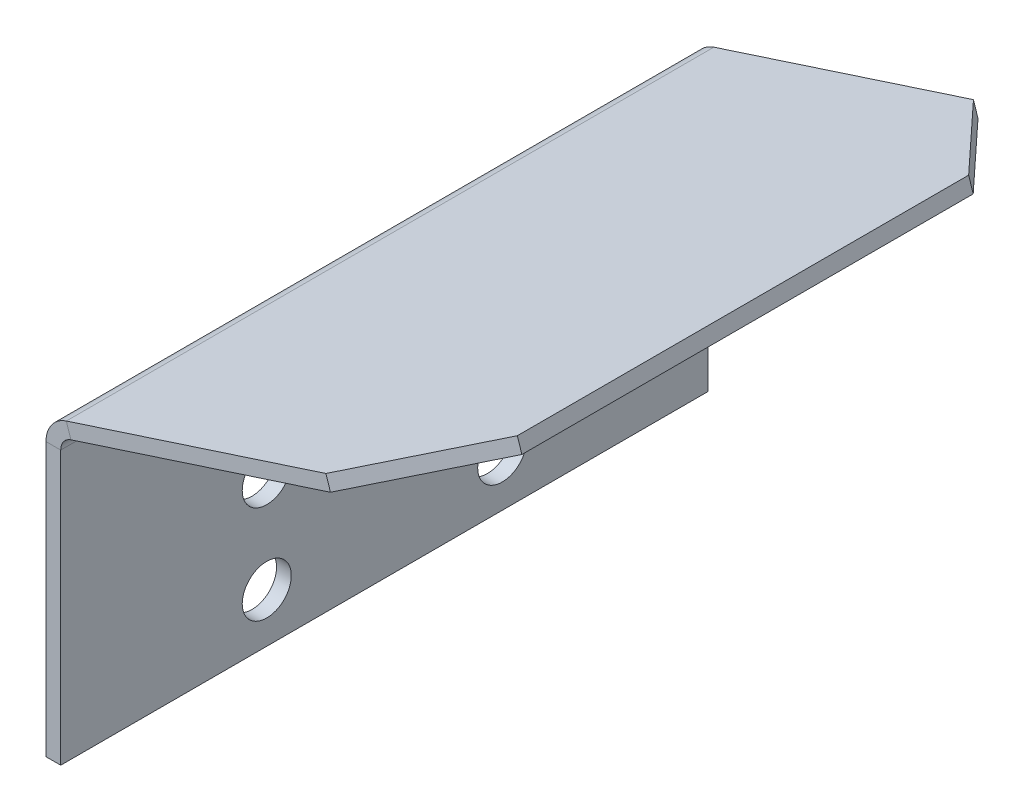
ISO-10303-21;
HEADER;
FILE_DESCRIPTION(('STEP AP214'),'2;1');
FILE_NAME('part.step','',(''),(''),'','','');
FILE_SCHEMA(('AUTOMOTIVE_DESIGN { 1 0 10303 214 1 1 1 1 }'));
ENDSEC;
DATA;
#1=APPLICATION_CONTEXT('core data for automotive mechanical design processes');
#2=APPLICATION_PROTOCOL_DEFINITION('international standard','automotive_design',2000,#1);
#3=PRODUCT_CONTEXT('',#1,'mechanical');
#4=PRODUCT('Part','Part','',(#3));
#5=PRODUCT_RELATED_PRODUCT_CATEGORY('part','',(#4));
#6=PRODUCT_DEFINITION_FORMATION('','',#4);
#7=PRODUCT_DEFINITION_CONTEXT('part definition',#1,'design');
#8=PRODUCT_DEFINITION('design','',#6,#7);
#9=PRODUCT_DEFINITION_SHAPE('','',#8);
#10=(LENGTH_UNIT() NAMED_UNIT(*) SI_UNIT(.MILLI.,.METRE.));
#11=(NAMED_UNIT(*) PLANE_ANGLE_UNIT() SI_UNIT($,.RADIAN.));
#12=(NAMED_UNIT(*) SI_UNIT($,.STERADIAN.) SOLID_ANGLE_UNIT());
#13=UNCERTAINTY_MEASURE_WITH_UNIT(LENGTH_MEASURE(1.E-05),#10,'distance_accuracy_value','');
#14=(GEOMETRIC_REPRESENTATION_CONTEXT(3) GLOBAL_UNCERTAINTY_ASSIGNED_CONTEXT((#13)) GLOBAL_UNIT_ASSIGNED_CONTEXT((#10,
#11,#12)) REPRESENTATION_CONTEXT('',''));
#15=CARTESIAN_POINT('',(0.,0.,0.));
#16=DIRECTION('',(0.,0.,1.));
#17=DIRECTION('',(1.,0.,0.));
#18=AXIS2_PLACEMENT_3D('',#15,#16,#17);
#19=CARTESIAN_POINT('',(2.07294901687517,0.673541964869374,33.));
#20=DIRECTION('',(0.,0.,1.));
#21=DIRECTION('',(1.,0.,0.));
#22=AXIS2_PLACEMENT_3D('',#19,#20,#21);
#23=PLANE('',#22);
#24=DIRECTION('',(0.309016994374945,-0.951056516295154,0.));
#25=VECTOR('',#24,1.);
#26=CARTESIAN_POINT('',(2.07294901687517,0.673541964869374,33.));
#27=LINE('',#26,#25);
#28=CARTESIAN_POINT('',(2.07294901687517,0.673541964869374,33.));
#29=VERTEX_POINT('',#28);
#30=CARTESIAN_POINT('',(2.53647450843758,-0.753042809573357,33.));
#31=VERTEX_POINT('',#30);
#32=EDGE_CURVE('E122',#29,#31,#27,.T.);
#33=ORIENTED_EDGE('',*,*,#32,.F.);
#34=CARTESIAN_POINT('',(3.,-2.17962758401609,33.));
#35=DIRECTION('',(0.,0.,1.));
#36=DIRECTION('',(1.,0.,0.));
#37=AXIS2_PLACEMENT_3D('',#34,#35,#36);
#38=CIRCLE('',#37,3.);
#39=CARTESIAN_POINT('',(0.,-2.17962758401609,33.));
#40=VERTEX_POINT('',#39);
#41=EDGE_CURVE('E125',#40,#29,#38,.F.);
#42=ORIENTED_EDGE('',*,*,#41,.F.);
#43=DIRECTION('',(-1.,0.,0.));
#44=VECTOR('',#43,1.);
#45=CARTESIAN_POINT('',(1.5,-2.17962758401609,33.));
#46=LINE('',#45,#44);
#47=CARTESIAN_POINT('',(1.5,-2.17962758401609,33.));
#48=VERTEX_POINT('',#47);
#49=EDGE_CURVE('E131',#48,#40,#46,.T.);
#50=ORIENTED_EDGE('',*,*,#49,.F.);
#51=CARTESIAN_POINT('',(3.,-2.17962758401609,33.));
#52=DIRECTION('',(0.,0.,1.));
#53=DIRECTION('',(1.,0.,0.));
#54=AXIS2_PLACEMENT_3D('',#51,#52,#53);
#55=CIRCLE('',#54,1.5);
#56=EDGE_CURVE('E128',#48,#31,#55,.F.);
#57=ORIENTED_EDGE('',*,*,#56,.T.);
#58=EDGE_LOOP('',(#33,#42,#50,#57));
#59=FACE_BOUND('',#58,.T.);
#60=ADVANCED_FACE('F45',(#59),#23,.T.);
#61=CARTESIAN_POINT('',(1.5,-2.17962758401609,33.));
#62=DIRECTION('',(0.,0.,1.));
#63=DIRECTION('',(1.,0.,0.));
#64=AXIS2_PLACEMENT_3D('',#61,#62,#63);
#65=PLANE('',#64);
#66=DIRECTION('',(0.951056516295155,0.309016994374945,0.));
#67=VECTOR('',#66,1.);
#68=CARTESIAN_POINT('',(0.463525491562417,-1.42658477444273,33.));
#69=LINE('',#68,#67);
#70=CARTESIAN_POINT('',(28.995220980417,7.84392505680559,33.));
#71=VERTEX_POINT('',#70);
#72=EDGE_CURVE('E149',#31,#71,#69,.T.);
#73=ORIENTED_EDGE('',*,*,#72,.T.);
#74=DIRECTION('',(-0.309016994374944,0.951056516295155,0.));
#75=VECTOR('',#74,1.);
#76=CARTESIAN_POINT('',(29.3155092177606,6.85817922158218,33.));
#77=LINE('',#76,#75);
#78=CARTESIAN_POINT('',(28.5316954888546,9.27050983124832,33.));
#79=VERTEX_POINT('',#78);
#80=EDGE_CURVE('E53',#71,#79,#77,.T.);
#81=ORIENTED_EDGE('',*,*,#80,.T.);
#82=DIRECTION('',(0.951056516295154,0.309016994374945,0.));
#83=VECTOR('',#82,1.);
#84=CARTESIAN_POINT('',(0.,0.,33.));
#85=LINE('',#84,#83);
#86=EDGE_CURVE('E138',#29,#79,#85,.T.);
#87=ORIENTED_EDGE('',*,*,#86,.F.);
#88=ORIENTED_EDGE('',*,*,#32,.T.);
#89=EDGE_LOOP('',(#73,#81,#87,#88));
#90=FACE_BOUND('',#89,.T.);
#91=ADVANCED_FACE('F148',(#90),#65,.T.);
#92=CARTESIAN_POINT('',(0.,-2.17962758401609,-33.));
#93=DIRECTION('',(0.,0.,-1.));
#94=DIRECTION('',(-1.,0.,0.));
#95=AXIS2_PLACEMENT_3D('',#92,#93,#94);
#96=PLANE('',#95);
#97=DIRECTION('',(1.,0.,0.));
#98=VECTOR('',#97,1.);
#99=CARTESIAN_POINT('',(0.,-2.17962758401609,-33.));
#100=LINE('',#99,#98);
#101=CARTESIAN_POINT('',(0.,-2.17962758401609,-33.));
#102=VERTEX_POINT('',#101);
#103=CARTESIAN_POINT('',(1.5,-2.17962758401609,-33.));
#104=VERTEX_POINT('',#103);
#105=EDGE_CURVE('E201',#102,#104,#100,.T.);
#106=ORIENTED_EDGE('',*,*,#105,.F.);
#107=CARTESIAN_POINT('',(3.,-2.17962758401609,-33.));
#108=DIRECTION('',(0.,0.,1.));
#109=DIRECTION('',(1.,0.,0.));
#110=AXIS2_PLACEMENT_3D('',#107,#108,#109);
#111=CIRCLE('',#110,3.);
#112=CARTESIAN_POINT('',(2.07294901687517,0.673541964869374,-33.));
#113=VERTEX_POINT('',#112);
#114=EDGE_CURVE('E172',#102,#113,#111,.F.);
#115=ORIENTED_EDGE('',*,*,#114,.T.);
#116=DIRECTION('',(-0.309016994374945,0.951056516295154,0.));
#117=VECTOR('',#116,1.);
#118=CARTESIAN_POINT('',(2.53647450843758,-0.753042809573357,-33.));
#119=LINE('',#118,#117);
#120=CARTESIAN_POINT('',(2.53647450843758,-0.753042809573357,-33.));
#121=VERTEX_POINT('',#120);
#122=EDGE_CURVE('E199',#121,#113,#119,.T.);
#123=ORIENTED_EDGE('',*,*,#122,.F.);
#124=CARTESIAN_POINT('',(3.,-2.17962758401609,-33.));
#125=DIRECTION('',(0.,0.,1.));
#126=DIRECTION('',(1.,0.,0.));
#127=AXIS2_PLACEMENT_3D('',#124,#125,#126);
#128=CIRCLE('',#127,1.5);
#129=EDGE_CURVE('E183',#104,#121,#128,.F.);
#130=ORIENTED_EDGE('',*,*,#129,.F.);
#131=EDGE_LOOP('',(#106,#115,#123,#130));
#132=FACE_BOUND('',#131,.T.);
#133=ADVANCED_FACE('F233',(#132),#96,.T.);
#134=CARTESIAN_POINT('',(2.53647450843758,-0.753042809573357,-33.));
#135=DIRECTION('',(0.,0.,-1.));
#136=DIRECTION('',(-1.,0.,0.));
#137=AXIS2_PLACEMENT_3D('',#134,#135,#136);
#138=PLANE('',#137);
#139=DIRECTION('',(0.,1.,0.));
#140=VECTOR('',#139,1.);
#141=CARTESIAN_POINT('',(0.,-30.,-33.));
#142=LINE('',#141,#140);
#143=CARTESIAN_POINT('',(0.,-30.,-33.));
#144=VERTEX_POINT('',#143);
#145=EDGE_CURVE('E174',#144,#102,#142,.T.);
#146=ORIENTED_EDGE('',*,*,#145,.T.);
#147=ORIENTED_EDGE('',*,*,#105,.T.);
#148=DIRECTION('',(0.,1.,0.));
#149=VECTOR('',#148,1.);
#150=CARTESIAN_POINT('',(1.5,-30.,-33.));
#151=LINE('',#150,#149);
#152=CARTESIAN_POINT('',(1.5,-30.,-33.));
#153=VERTEX_POINT('',#152);
#154=EDGE_CURVE('E180',#153,#104,#151,.T.);
#155=ORIENTED_EDGE('',*,*,#154,.F.);
#156=DIRECTION('',(-1.,0.,0.));
#157=VECTOR('',#156,1.);
#158=CARTESIAN_POINT('',(1.5,-30.,-33.));
#159=LINE('',#158,#157);
#160=EDGE_CURVE('E177',#153,#144,#159,.T.);
#161=ORIENTED_EDGE('',*,*,#160,.T.);
#162=EDGE_LOOP('',(#146,#147,#155,#161));
#163=FACE_BOUND('',#162,.T.);
#164=ADVANCED_FACE('F286',(#163),#138,.T.);
#165=CARTESIAN_POINT('',(0.463525491562417,-1.42658477444273,33.));
#166=DIRECTION('',(-0.309016994374945,0.951056516295154,0.));
#167=DIRECTION('',(-0.951056516295155,-0.309016994374945,0.));
#168=AXIS2_PLACEMENT_3D('',#165,#166,#167);
#169=PLANE('',#168);
#170=DIRECTION('',(0.,0.,-1.));
#171=VECTOR('',#170,1.);
#172=CARTESIAN_POINT('',(38.5057861433686,10.9340950005551,33.));
#173=LINE('',#172,#171);
#174=CARTESIAN_POINT('',(38.5057861433686,10.9340950005551,22.9999999999999));
#175=VERTEX_POINT('',#174);
#176=CARTESIAN_POINT('',(38.5057861433686,10.9340950005551,-22.9999999999999));
#177=VERTEX_POINT('',#176);
#178=EDGE_CURVE('E197',#175,#177,#173,.T.);
#179=ORIENTED_EDGE('',*,*,#178,.F.);
#180=DIRECTION('',(0.672498511963958,0.218508012224409,-0.707106781186548));
#181=VECTOR('',#180,1.);
#182=CARTESIAN_POINT('',(38.5057861433686,10.9340950005551,22.9999999999999));
#183=LINE('',#182,#181);
#184=EDGE_CURVE('E67',#175,#71,#183,.F.);
#185=ORIENTED_EDGE('',*,*,#184,.T.);
#186=ORIENTED_EDGE('',*,*,#72,.F.);
#187=DIRECTION('',(0.,0.,-1.));
#188=VECTOR('',#187,1.);
#189=CARTESIAN_POINT('',(2.53647450843758,-0.753042809573357,33.));
#190=LINE('',#189,#188);
#191=EDGE_CURVE('E166',#31,#121,#190,.T.);
#192=ORIENTED_EDGE('',*,*,#191,.T.);
#193=DIRECTION('',(0.951056516295155,0.309016994374945,0.));
#194=VECTOR('',#193,1.);
#195=CARTESIAN_POINT('',(0.463525491562417,-1.42658477444273,-33.));
#196=LINE('',#195,#194);
#197=CARTESIAN_POINT('',(28.995220980417,7.84392505680559,-33.));
#198=VERTEX_POINT('',#197);
#199=EDGE_CURVE('E167',#121,#198,#196,.T.);
#200=ORIENTED_EDGE('',*,*,#199,.T.);
#201=DIRECTION('',(0.672498511963958,0.218508012224409,0.707106781186548));
#202=VECTOR('',#201,1.);
#203=CARTESIAN_POINT('',(28.995220980417,7.84392505680559,-33.));
#204=LINE('',#203,#202);
#205=EDGE_CURVE('E206',#198,#177,#204,.T.);
#206=ORIENTED_EDGE('',*,*,#205,.T.);
#207=EDGE_LOOP('',(#179,#185,#186,#192,#200,#206));
#208=FACE_BOUND('',#207,.T.);
#209=ADVANCED_FACE('F222',(#208),#169,.F.);
#210=CARTESIAN_POINT('',(38.0422606518062,12.3606797749978,33.));
#211=DIRECTION('',(0.951056516295155,0.309016994374944,0.));
#212=DIRECTION('',(-0.309016994374944,0.951056516295155,0.));
#213=AXIS2_PLACEMENT_3D('',#210,#211,#212);
#214=PLANE('',#213);
#215=DIRECTION('',(0.,0.,-1.));
#216=VECTOR('',#215,1.);
#217=CARTESIAN_POINT('',(38.0422606518062,12.3606797749978,33.));
#218=LINE('',#217,#216);
#219=CARTESIAN_POINT('',(38.0422606518062,12.3606797749978,22.9999999999999));
#220=VERTEX_POINT('',#219);
#221=CARTESIAN_POINT('',(38.0422606518062,12.3606797749978,-22.9999999999999));
#222=VERTEX_POINT('',#221);
#223=EDGE_CURVE('E145',#220,#222,#218,.T.);
#224=ORIENTED_EDGE('',*,*,#223,.F.);
#225=DIRECTION('',(0.309016994374944,-0.951056516295155,0.));
#226=VECTOR('',#225,1.);
#227=CARTESIAN_POINT('',(38.0422606518062,12.3606797749978,22.9999999999999));
#228=LINE('',#227,#226);
#229=EDGE_CURVE('E214',#220,#175,#228,.T.);
#230=ORIENTED_EDGE('',*,*,#229,.T.);
#231=ORIENTED_EDGE('',*,*,#178,.T.);
#232=DIRECTION('',(-0.309016994374944,0.951056516295155,0.));
#233=VECTOR('',#232,1.);
#234=CARTESIAN_POINT('',(38.0422606518062,12.3606797749978,-22.9999999999999));
#235=LINE('',#234,#233);
#236=EDGE_CURVE('E209',#177,#222,#235,.T.);
#237=ORIENTED_EDGE('',*,*,#236,.T.);
#238=EDGE_LOOP('',(#224,#230,#231,#237));
#239=FACE_BOUND('',#238,.T.);
#240=ADVANCED_FACE('F220',(#239),#214,.T.);
#241=CARTESIAN_POINT('',(0.,0.,33.));
#242=DIRECTION('',(-0.309016994374945,0.951056516295154,0.));
#243=DIRECTION('',(-0.951056516295155,-0.309016994374945,0.));
#244=AXIS2_PLACEMENT_3D('',#241,#242,#243);
#245=PLANE('',#244);
#246=ORIENTED_EDGE('',*,*,#86,.T.);
#247=DIRECTION('',(-0.672498511963958,-0.218508012224409,0.707106781186548));
#248=VECTOR('',#247,1.);
#249=CARTESIAN_POINT('',(14.2658477444273,4.63525491562416,48.));
#250=LINE('',#249,#248);
#251=EDGE_CURVE('E11',#79,#220,#250,.F.);
#252=ORIENTED_EDGE('',*,*,#251,.T.);
#253=ORIENTED_EDGE('',*,*,#223,.T.);
#254=DIRECTION('',(-0.672498511963958,-0.218508012224409,-0.707106781186548));
#255=VECTOR('',#254,1.);
#256=CARTESIAN_POINT('',(45.6507127821674,14.8328157299973,-15.));
#257=LINE('',#256,#255);
#258=CARTESIAN_POINT('',(28.5316954888546,9.27050983124832,-33.));
#259=VERTEX_POINT('',#258);
#260=EDGE_CURVE('E212',#222,#259,#257,.T.);
#261=ORIENTED_EDGE('',*,*,#260,.T.);
#262=DIRECTION('',(0.951056516295154,0.309016994374945,0.));
#263=VECTOR('',#262,1.);
#264=CARTESIAN_POINT('',(0.,0.,-33.));
#265=LINE('',#264,#263);
#266=EDGE_CURVE('E141',#113,#259,#265,.T.);
#267=ORIENTED_EDGE('',*,*,#266,.F.);
#268=DIRECTION('',(0.,0.,-1.));
#269=VECTOR('',#268,1.);
#270=CARTESIAN_POINT('',(2.07294901687517,0.673541964869374,33.));
#271=LINE('',#270,#269);
#272=EDGE_CURVE('E136',#29,#113,#271,.T.);
#273=ORIENTED_EDGE('',*,*,#272,.F.);
#274=EDGE_LOOP('',(#246,#252,#253,#261,#267,#273));
#275=FACE_BOUND('',#274,.T.);
#276=ADVANCED_FACE('F137',(#275),#245,.T.);
#277=CARTESIAN_POINT('',(3.,-2.17962758401609,33.));
#278=DIRECTION('',(0.,0.,-1.));
#279=DIRECTION('',(-1.,0.,0.));
#280=AXIS2_PLACEMENT_3D('',#277,#278,#279);
#281=CYLINDRICAL_SURFACE('',#280,3.);
#282=ORIENTED_EDGE('',*,*,#114,.F.);
#283=DIRECTION('',(0.,0.,-1.));
#284=VECTOR('',#283,1.);
#285=CARTESIAN_POINT('',(0.,-2.17962758401609,33.));
#286=LINE('',#285,#284);
#287=EDGE_CURVE('E146',#40,#102,#286,.T.);
#288=ORIENTED_EDGE('',*,*,#287,.F.);
#289=ORIENTED_EDGE('',*,*,#41,.T.);
#290=ORIENTED_EDGE('',*,*,#272,.T.);
#291=EDGE_LOOP('',(#282,#288,#289,#290));
#292=FACE_BOUND('',#291,.T.);
#293=ADVANCED_FACE('F152',(#292),#281,.T.);
#294=CARTESIAN_POINT('',(0.,-30.,33.));
#295=DIRECTION('',(-1.,0.,0.));
#296=DIRECTION('',(0.,0.,1.));
#297=AXIS2_PLACEMENT_3D('',#294,#295,#296);
#298=PLANE('',#297);
#299=CARTESIAN_POINT('',(0.,-25.,-12.));
#300=DIRECTION('',(-1.,0.,0.));
#301=DIRECTION('',(0.,0.,1.));
#302=AXIS2_PLACEMENT_3D('',#299,#300,#301);
#303=CIRCLE('',#302,2.49999999999999);
#304=CARTESIAN_POINT('',(0.,-25.,-9.50000000000004));
#305=VERTEX_POINT('',#304);
#306=EDGE_CURVE('E251',#305,#305,#303,.T.);
#307=ORIENTED_EDGE('',*,*,#306,.F.);
#308=EDGE_LOOP('',(#307));
#309=FACE_BOUND('',#308,.T.);
#310=CARTESIAN_POINT('',(0.,-15.,12.));
#311=DIRECTION('',(-1.,0.,0.));
#312=DIRECTION('',(0.,0.,1.));
#313=AXIS2_PLACEMENT_3D('',#310,#311,#312);
#314=CIRCLE('',#313,2.49999999999999);
#315=CARTESIAN_POINT('',(0.,-15.,14.5));
#316=VERTEX_POINT('',#315);
#317=EDGE_CURVE('E244',#316,#316,#314,.T.);
#318=ORIENTED_EDGE('',*,*,#317,.F.);
#319=EDGE_LOOP('',(#318));
#320=FACE_BOUND('',#319,.T.);
#321=CARTESIAN_POINT('',(0.,-15.,-12.));
#322=DIRECTION('',(-1.,0.,0.));
#323=DIRECTION('',(0.,0.,1.));
#324=AXIS2_PLACEMENT_3D('',#321,#322,#323);
#325=CIRCLE('',#324,2.49999999999999);
#326=CARTESIAN_POINT('',(0.,-15.,-9.50000000000004));
#327=VERTEX_POINT('',#326);
#328=EDGE_CURVE('E256',#327,#327,#325,.T.);
#329=ORIENTED_EDGE('',*,*,#328,.F.);
#330=EDGE_LOOP('',(#329));
#331=FACE_BOUND('',#330,.T.);
#332=CARTESIAN_POINT('',(0.,-25.,12.));
#333=DIRECTION('',(-1.,0.,0.));
#334=DIRECTION('',(0.,0.,1.));
#335=AXIS2_PLACEMENT_3D('',#332,#333,#334);
#336=CIRCLE('',#335,2.49999999999999);
#337=CARTESIAN_POINT('',(0.,-25.,14.5));
#338=VERTEX_POINT('',#337);
#339=EDGE_CURVE('E238',#338,#338,#336,.T.);
#340=ORIENTED_EDGE('',*,*,#339,.F.);
#341=EDGE_LOOP('',(#340));
#342=FACE_BOUND('',#341,.T.);
#343=ORIENTED_EDGE('',*,*,#145,.F.);
#344=DIRECTION('',(0.,0.,-1.));
#345=VECTOR('',#344,1.);
#346=CARTESIAN_POINT('',(0.,-30.,33.));
#347=LINE('',#346,#345);
#348=CARTESIAN_POINT('',(0.,-30.,33.));
#349=VERTEX_POINT('',#348);
#350=EDGE_CURVE('E193',#349,#144,#347,.T.);
#351=ORIENTED_EDGE('',*,*,#350,.F.);
#352=DIRECTION('',(0.,1.,0.));
#353=VECTOR('',#352,1.);
#354=CARTESIAN_POINT('',(0.,-30.,33.));
#355=LINE('',#354,#353);
#356=EDGE_CURVE('E154',#349,#40,#355,.T.);
#357=ORIENTED_EDGE('',*,*,#356,.T.);
#358=ORIENTED_EDGE('',*,*,#287,.T.);
#359=EDGE_LOOP('',(#343,#351,#357,#358));
#360=FACE_BOUND('',#359,.T.);
#361=ADVANCED_FACE('F273',(#309,#320,#331,#342,#360),#298,.T.);
#362=CARTESIAN_POINT('',(1.5,-30.,33.));
#363=DIRECTION('',(0.,-1.,0.));
#364=DIRECTION('',(0.,0.,-1.));
#365=AXIS2_PLACEMENT_3D('',#362,#363,#364);
#366=PLANE('',#365);
#367=ORIENTED_EDGE('',*,*,#160,.F.);
#368=DIRECTION('',(0.,0.,-1.));
#369=VECTOR('',#368,1.);
#370=CARTESIAN_POINT('',(1.5,-30.,33.));
#371=LINE('',#370,#369);
#372=CARTESIAN_POINT('',(1.5,-30.,33.));
#373=VERTEX_POINT('',#372);
#374=EDGE_CURVE('E191',#373,#153,#371,.T.);
#375=ORIENTED_EDGE('',*,*,#374,.F.);
#376=DIRECTION('',(-1.,0.,0.));
#377=VECTOR('',#376,1.);
#378=CARTESIAN_POINT('',(1.5,-30.,33.));
#379=LINE('',#378,#377);
#380=EDGE_CURVE('E156',#373,#349,#379,.T.);
#381=ORIENTED_EDGE('',*,*,#380,.T.);
#382=ORIENTED_EDGE('',*,*,#350,.T.);
#383=EDGE_LOOP('',(#367,#375,#381,#382));
#384=FACE_BOUND('',#383,.T.);
#385=ADVANCED_FACE('F276',(#384),#366,.T.);
#386=CARTESIAN_POINT('',(1.5,-30.,33.));
#387=DIRECTION('',(-1.,0.,0.));
#388=DIRECTION('',(0.,0.,1.));
#389=AXIS2_PLACEMENT_3D('',#386,#387,#388);
#390=PLANE('',#389);
#391=CARTESIAN_POINT('',(1.5,-25.,-12.));
#392=DIRECTION('',(-1.,0.,0.));
#393=DIRECTION('',(0.,0.,1.));
#394=AXIS2_PLACEMENT_3D('',#391,#392,#393);
#395=CIRCLE('',#394,2.49999999999999);
#396=CARTESIAN_POINT('',(1.5,-25.,-9.50000000000004));
#397=VERTEX_POINT('',#396);
#398=EDGE_CURVE('E241',#397,#397,#395,.T.);
#399=ORIENTED_EDGE('',*,*,#398,.T.);
#400=EDGE_LOOP('',(#399));
#401=FACE_BOUND('',#400,.T.);
#402=CARTESIAN_POINT('',(1.5,-15.,12.));
#403=DIRECTION('',(-1.,0.,0.));
#404=DIRECTION('',(0.,0.,1.));
#405=AXIS2_PLACEMENT_3D('',#402,#403,#404);
#406=CIRCLE('',#405,2.49999999999999);
#407=CARTESIAN_POINT('',(1.5,-15.,14.5));
#408=VERTEX_POINT('',#407);
#409=EDGE_CURVE('E247',#408,#408,#406,.T.);
#410=ORIENTED_EDGE('',*,*,#409,.T.);
#411=EDGE_LOOP('',(#410));
#412=FACE_BOUND('',#411,.T.);
#413=CARTESIAN_POINT('',(1.5,-15.,-12.));
#414=DIRECTION('',(-1.,0.,0.));
#415=DIRECTION('',(0.,0.,1.));
#416=AXIS2_PLACEMENT_3D('',#413,#414,#415);
#417=CIRCLE('',#416,2.49999999999999);
#418=CARTESIAN_POINT('',(1.5,-15.,-9.50000000000004));
#419=VERTEX_POINT('',#418);
#420=EDGE_CURVE('E248',#419,#419,#417,.T.);
#421=ORIENTED_EDGE('',*,*,#420,.T.);
#422=EDGE_LOOP('',(#421));
#423=FACE_BOUND('',#422,.T.);
#424=CARTESIAN_POINT('',(1.5,-25.,12.));
#425=DIRECTION('',(-1.,0.,0.));
#426=DIRECTION('',(0.,0.,1.));
#427=AXIS2_PLACEMENT_3D('',#424,#425,#426);
#428=CIRCLE('',#427,2.49999999999999);
#429=CARTESIAN_POINT('',(1.5,-25.,14.5));
#430=VERTEX_POINT('',#429);
#431=EDGE_CURVE('E170',#430,#430,#428,.T.);
#432=ORIENTED_EDGE('',*,*,#431,.T.);
#433=EDGE_LOOP('',(#432));
#434=FACE_BOUND('',#433,.T.);
#435=ORIENTED_EDGE('',*,*,#154,.T.);
#436=DIRECTION('',(0.,0.,-1.));
#437=VECTOR('',#436,1.);
#438=CARTESIAN_POINT('',(1.5,-2.17962758401609,33.));
#439=LINE('',#438,#437);
#440=EDGE_CURVE('E188',#48,#104,#439,.T.);
#441=ORIENTED_EDGE('',*,*,#440,.F.);
#442=DIRECTION('',(0.,1.,0.));
#443=VECTOR('',#442,1.);
#444=CARTESIAN_POINT('',(1.5,-30.,33.));
#445=LINE('',#444,#443);
#446=EDGE_CURVE('E162',#373,#48,#445,.T.);
#447=ORIENTED_EDGE('',*,*,#446,.F.);
#448=ORIENTED_EDGE('',*,*,#374,.T.);
#449=EDGE_LOOP('',(#435,#441,#447,#448));
#450=FACE_BOUND('',#449,.T.);
#451=ADVANCED_FACE('F262',(#401,#412,#423,#434,#450),#390,.F.);
#452=CARTESIAN_POINT('',(3.,-2.17962758401609,33.));
#453=DIRECTION('',(0.,0.,-1.));
#454=DIRECTION('',(-1.,0.,0.));
#455=AXIS2_PLACEMENT_3D('',#452,#453,#454);
#456=CYLINDRICAL_SURFACE('',#455,1.5);
#457=ORIENTED_EDGE('',*,*,#129,.T.);
#458=ORIENTED_EDGE('',*,*,#191,.F.);
#459=ORIENTED_EDGE('',*,*,#56,.F.);
#460=ORIENTED_EDGE('',*,*,#440,.T.);
#461=EDGE_LOOP('',(#457,#458,#459,#460));
#462=FACE_BOUND('',#461,.T.);
#463=ADVANCED_FACE('F235',(#462),#456,.F.);
#464=CARTESIAN_POINT('',(3.,-2.17962758401609,33.));
#465=DIRECTION('',(0.,0.,1.));
#466=DIRECTION('',(1.,0.,0.));
#467=AXIS2_PLACEMENT_3D('',#464,#465,#466);
#468=PLANE('',#467);
#469=ORIENTED_EDGE('',*,*,#446,.T.);
#470=ORIENTED_EDGE('',*,*,#49,.T.);
#471=ORIENTED_EDGE('',*,*,#356,.F.);
#472=ORIENTED_EDGE('',*,*,#380,.F.);
#473=EDGE_LOOP('',(#469,#470,#471,#472));
#474=FACE_BOUND('',#473,.T.);
#475=ADVANCED_FACE('F291',(#474),#468,.T.);
#476=CARTESIAN_POINT('',(3.,-2.17962758401609,-33.));
#477=DIRECTION('',(0.,0.,1.));
#478=DIRECTION('',(1.,0.,0.));
#479=AXIS2_PLACEMENT_3D('',#476,#477,#478);
#480=PLANE('',#479);
#481=ORIENTED_EDGE('',*,*,#266,.T.);
#482=DIRECTION('',(0.309016994374944,-0.951056516295155,0.));
#483=VECTOR('',#482,1.);
#484=CARTESIAN_POINT('',(28.995220980417,7.8439250568056,-33.));
#485=LINE('',#484,#483);
#486=EDGE_CURVE('E130',#259,#198,#485,.T.);
#487=ORIENTED_EDGE('',*,*,#486,.T.);
#488=ORIENTED_EDGE('',*,*,#199,.F.);
#489=ORIENTED_EDGE('',*,*,#122,.T.);
#490=EDGE_LOOP('',(#481,#487,#488,#489));
#491=FACE_BOUND('',#490,.T.);
#492=ADVANCED_FACE('F230',(#491),#480,.F.);
#493=CARTESIAN_POINT('',(1.5,-25.,12.));
#494=DIRECTION('',(-1.,0.,0.));
#495=DIRECTION('',(0.,0.,1.));
#496=AXIS2_PLACEMENT_3D('',#493,#494,#495);
#497=CYLINDRICAL_SURFACE('',#496,2.49999999999999);
#498=ORIENTED_EDGE('',*,*,#431,.F.);
#499=EDGE_LOOP('',(#498));
#500=FACE_BOUND('',#499,.T.);
#501=ORIENTED_EDGE('',*,*,#339,.T.);
#502=EDGE_LOOP('',(#501));
#503=FACE_BOUND('',#502,.T.);
#504=ADVANCED_FACE('F269',(#500,#503),#497,.F.);
#505=CARTESIAN_POINT('',(1.5,-15.,-12.));
#506=DIRECTION('',(-1.,0.,0.));
#507=DIRECTION('',(0.,0.,1.));
#508=AXIS2_PLACEMENT_3D('',#505,#506,#507);
#509=CYLINDRICAL_SURFACE('',#508,2.49999999999999);
#510=ORIENTED_EDGE('',*,*,#420,.F.);
#511=EDGE_LOOP('',(#510));
#512=FACE_BOUND('',#511,.T.);
#513=ORIENTED_EDGE('',*,*,#328,.T.);
#514=EDGE_LOOP('',(#513));
#515=FACE_BOUND('',#514,.T.);
#516=ADVANCED_FACE('F265',(#512,#515),#509,.F.);
#517=CARTESIAN_POINT('',(1.5,-15.,12.));
#518=DIRECTION('',(-1.,0.,0.));
#519=DIRECTION('',(0.,0.,1.));
#520=AXIS2_PLACEMENT_3D('',#517,#518,#519);
#521=CYLINDRICAL_SURFACE('',#520,2.49999999999999);
#522=ORIENTED_EDGE('',*,*,#409,.F.);
#523=EDGE_LOOP('',(#522));
#524=FACE_BOUND('',#523,.T.);
#525=ORIENTED_EDGE('',*,*,#317,.T.);
#526=EDGE_LOOP('',(#525));
#527=FACE_BOUND('',#526,.T.);
#528=ADVANCED_FACE('F268',(#524,#527),#521,.F.);
#529=CARTESIAN_POINT('',(1.5,-25.,-12.));
#530=DIRECTION('',(-1.,0.,0.));
#531=DIRECTION('',(0.,0.,1.));
#532=AXIS2_PLACEMENT_3D('',#529,#530,#531);
#533=CYLINDRICAL_SURFACE('',#532,2.49999999999999);
#534=ORIENTED_EDGE('',*,*,#398,.F.);
#535=EDGE_LOOP('',(#534));
#536=FACE_BOUND('',#535,.T.);
#537=ORIENTED_EDGE('',*,*,#306,.T.);
#538=EDGE_LOOP('',(#537));
#539=FACE_BOUND('',#538,.T.);
#540=ADVANCED_FACE('F313',(#536,#539),#533,.F.);
#541=CARTESIAN_POINT('',(29.4587464719794,6.41734028236283,-33.));
#542=DIRECTION('',(0.672498511963958,0.218508012224408,-0.707106781186547));
#543=DIRECTION('',(-0.309016994374944,0.951056516295155,0.));
#544=AXIS2_PLACEMENT_3D('',#541,#542,#543);
#545=PLANE('',#544);
#546=ORIENTED_EDGE('',*,*,#260,.F.);
#547=ORIENTED_EDGE('',*,*,#236,.F.);
#548=ORIENTED_EDGE('',*,*,#205,.F.);
#549=ORIENTED_EDGE('',*,*,#486,.F.);
#550=EDGE_LOOP('',(#546,#547,#548,#549));
#551=FACE_BOUND('',#550,.T.);
#552=ADVANCED_FACE('F228',(#551),#545,.T.);
#553=CARTESIAN_POINT('',(38.0422606518062,12.3606797749978,22.9999999999999));
#554=DIRECTION('',(-0.672498511963958,-0.218508012224408,-0.707106781186547));
#555=DIRECTION('',(0.309016994374944,-0.951056516295155,0.));
#556=AXIS2_PLACEMENT_3D('',#553,#554,#555);
#557=PLANE('',#556);
#558=ORIENTED_EDGE('',*,*,#251,.F.);
#559=ORIENTED_EDGE('',*,*,#80,.F.);
#560=ORIENTED_EDGE('',*,*,#184,.F.);
#561=ORIENTED_EDGE('',*,*,#229,.F.);
#562=EDGE_LOOP('',(#558,#559,#560,#561));
#563=FACE_BOUND('',#562,.T.);
#564=ADVANCED_FACE('F47',(#563),#557,.F.);
#565=CLOSED_SHELL('',(#60,#91,#133,#164,#209,#240,#276,#293,#361,#385,#451,#463,#475,#492,#504,
#516,#528,#540,#552,#564));
#566=MANIFOLD_SOLID_BREP('B2',#565);
#567=ADVANCED_BREP_SHAPE_REPRESENTATION('',(#18,#566),#14);
#568=SHAPE_DEFINITION_REPRESENTATION(#9,#567);
ENDSEC;
END-ISO-10303-21;
